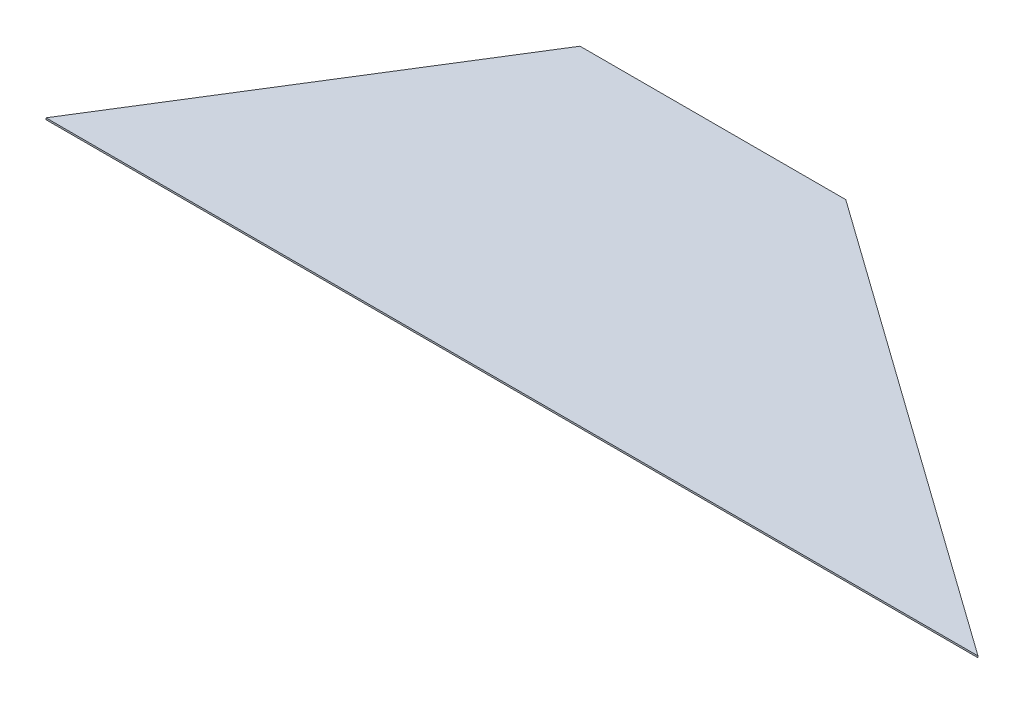
ISO-10303-21;
HEADER;
FILE_DESCRIPTION(('STEP AP214'),'2;1');
FILE_NAME('part.step','',(''),(''),'','','');
FILE_SCHEMA(('AUTOMOTIVE_DESIGN { 1 0 10303 214 1 1 1 1 }'));
ENDSEC;
DATA;
#1=APPLICATION_CONTEXT('core data for automotive mechanical design processes');
#2=APPLICATION_PROTOCOL_DEFINITION('international standard','automotive_design',2000,#1);
#3=PRODUCT_CONTEXT('',#1,'mechanical');
#4=PRODUCT('Part','Part','',(#3));
#5=PRODUCT_RELATED_PRODUCT_CATEGORY('part','',(#4));
#6=PRODUCT_DEFINITION_FORMATION('','',#4);
#7=PRODUCT_DEFINITION_CONTEXT('part definition',#1,'design');
#8=PRODUCT_DEFINITION('design','',#6,#7);
#9=PRODUCT_DEFINITION_SHAPE('','',#8);
#10=(LENGTH_UNIT() NAMED_UNIT(*) SI_UNIT(.MILLI.,.METRE.));
#11=(NAMED_UNIT(*) PLANE_ANGLE_UNIT() SI_UNIT($,.RADIAN.));
#12=(NAMED_UNIT(*) SI_UNIT($,.STERADIAN.) SOLID_ANGLE_UNIT());
#13=UNCERTAINTY_MEASURE_WITH_UNIT(LENGTH_MEASURE(1.E-05),#10,'distance_accuracy_value','');
#14=(GEOMETRIC_REPRESENTATION_CONTEXT(3) GLOBAL_UNCERTAINTY_ASSIGNED_CONTEXT((#13)) GLOBAL_UNIT_ASSIGNED_CONTEXT((#10,
#11,#12)) REPRESENTATION_CONTEXT('',''));
#15=CARTESIAN_POINT('',(0.,0.,0.));
#16=DIRECTION('',(0.,0.,1.));
#17=DIRECTION('',(1.,0.,0.));
#18=AXIS2_PLACEMENT_3D('',#15,#16,#17);
#19=CARTESIAN_POINT('',(52.381220258664,0.762,-98.6513718577558));
#20=DIRECTION('',(-0.580724681627554,0.,0.814100020973207));
#21=DIRECTION('',(0.814100020973207,0.,0.580724681627554));
#22=AXIS2_PLACEMENT_3D('',#19,#20,#21);
#23=PLANE('',#22);
#24=DIRECTION('',(-0.814100020973207,0.,-0.580724681627554));
#25=VECTOR('',#24,1.);
#26=CARTESIAN_POINT('',(52.381220258664,0.,-98.6513718577558));
#27=LINE('',#26,#25);
#28=CARTESIAN_POINT('',(263.177481940907,0.,51.7166281422441));
#29=VERTEX_POINT('',#28);
#30=CARTESIAN_POINT('',(52.381220258664,0.,-98.6513718577558));
#31=VERTEX_POINT('',#30);
#32=EDGE_CURVE('E98',#29,#31,#27,.T.);
#33=ORIENTED_EDGE('',*,*,#32,.T.);
#34=DIRECTION('',(0.,-1.,0.));
#35=VECTOR('',#34,1.);
#36=CARTESIAN_POINT('',(52.381220258664,0.762,-98.6513718577558));
#37=LINE('',#36,#35);
#38=CARTESIAN_POINT('',(52.381220258664,0.762,-98.6513718577558));
#39=VERTEX_POINT('',#38);
#40=EDGE_CURVE('E11',#39,#31,#37,.T.);
#41=ORIENTED_EDGE('',*,*,#40,.F.);
#42=DIRECTION('',(-0.814100020973207,0.,-0.580724681627554));
#43=VECTOR('',#42,1.);
#44=CARTESIAN_POINT('',(52.381220258664,0.762,-98.6513718577558));
#45=LINE('',#44,#43);
#46=CARTESIAN_POINT('',(263.177481940907,0.762,51.7166281422441));
#47=VERTEX_POINT('',#46);
#48=EDGE_CURVE('E86',#47,#39,#45,.T.);
#49=ORIENTED_EDGE('',*,*,#48,.F.);
#50=DIRECTION('',(0.,-1.,0.));
#51=VECTOR('',#50,1.);
#52=CARTESIAN_POINT('',(263.177481940907,0.762,51.7166281422441));
#53=LINE('',#52,#51);
#54=EDGE_CURVE('E94',#47,#29,#53,.T.);
#55=ORIENTED_EDGE('',*,*,#54,.T.);
#56=EDGE_LOOP('',(#33,#41,#49,#55));
#57=FACE_BOUND('',#56,.T.);
#58=ADVANCED_FACE('F35',(#57),#23,.F.);
#59=CARTESIAN_POINT('',(-69.0607444777623,0.762,-98.6513718577558));
#60=DIRECTION('',(0.,0.,1.));
#61=DIRECTION('',(1.,0.,0.));
#62=AXIS2_PLACEMENT_3D('',#59,#60,#61);
#63=PLANE('',#62);
#64=DIRECTION('',(-1.,0.,0.));
#65=VECTOR('',#64,1.);
#66=CARTESIAN_POINT('',(-69.0607444777623,0.,-98.6513718577558));
#67=LINE('',#66,#65);
#68=CARTESIAN_POINT('',(-69.0607444777623,0.,-98.6513718577558));
#69=VERTEX_POINT('',#68);
#70=EDGE_CURVE('E90',#31,#69,#67,.T.);
#71=ORIENTED_EDGE('',*,*,#70,.T.);
#72=DIRECTION('',(0.,-1.,0.));
#73=VECTOR('',#72,1.);
#74=CARTESIAN_POINT('',(-69.0607444777623,0.762,-98.6513718577558));
#75=LINE('',#74,#73);
#76=CARTESIAN_POINT('',(-69.0607444777623,0.762,-98.6513718577558));
#77=VERTEX_POINT('',#76);
#78=EDGE_CURVE('E43',#77,#69,#75,.T.);
#79=ORIENTED_EDGE('',*,*,#78,.F.);
#80=DIRECTION('',(-1.,0.,0.));
#81=VECTOR('',#80,1.);
#82=CARTESIAN_POINT('',(-69.0607444777623,0.762,-98.6513718577558));
#83=LINE('',#82,#81);
#84=EDGE_CURVE('E81',#39,#77,#83,.T.);
#85=ORIENTED_EDGE('',*,*,#84,.F.);
#86=ORIENTED_EDGE('',*,*,#40,.T.);
#87=EDGE_LOOP('',(#71,#79,#85,#86));
#88=FACE_BOUND('',#87,.T.);
#89=ADVANCED_FACE('F89',(#88),#63,.F.);
#90=CARTESIAN_POINT('',(-162.747971892092,0.762,51.7166281422441));
#91=DIRECTION('',(0.848740182159889,0.,0.52881008234261));
#92=DIRECTION('',(0.52881008234261,0.,-0.848740182159889));
#93=AXIS2_PLACEMENT_3D('',#90,#91,#92);
#94=PLANE('',#93);
#95=DIRECTION('',(-0.52881008234261,0.,0.848740182159889));
#96=VECTOR('',#95,1.);
#97=CARTESIAN_POINT('',(-162.747971892092,0.,51.7166281422441));
#98=LINE('',#97,#96);
#99=CARTESIAN_POINT('',(-162.747971892092,0.,51.7166281422441));
#100=VERTEX_POINT('',#99);
#101=EDGE_CURVE('E68',#69,#100,#98,.T.);
#102=ORIENTED_EDGE('',*,*,#101,.T.);
#103=DIRECTION('',(0.,-1.,0.));
#104=VECTOR('',#103,1.);
#105=CARTESIAN_POINT('',(-162.747971892092,0.762,51.7166281422441));
#106=LINE('',#105,#104);
#107=CARTESIAN_POINT('',(-162.747971892092,0.762,51.7166281422441));
#108=VERTEX_POINT('',#107);
#109=EDGE_CURVE('E91',#108,#100,#106,.T.);
#110=ORIENTED_EDGE('',*,*,#109,.F.);
#111=DIRECTION('',(-0.52881008234261,0.,0.848740182159889));
#112=VECTOR('',#111,1.);
#113=CARTESIAN_POINT('',(-162.747971892092,0.762,51.7166281422441));
#114=LINE('',#113,#112);
#115=EDGE_CURVE('E84',#77,#108,#114,.T.);
#116=ORIENTED_EDGE('',*,*,#115,.F.);
#117=ORIENTED_EDGE('',*,*,#78,.T.);
#118=EDGE_LOOP('',(#102,#110,#116,#117));
#119=FACE_BOUND('',#118,.T.);
#120=ADVANCED_FACE('F92',(#119),#94,.F.);
#121=CARTESIAN_POINT('',(263.177481940907,0.762,51.7166281422441));
#122=DIRECTION('',(0.,0.,-1.));
#123=DIRECTION('',(-1.,0.,0.));
#124=AXIS2_PLACEMENT_3D('',#121,#122,#123);
#125=PLANE('',#124);
#126=DIRECTION('',(1.,0.,0.));
#127=VECTOR('',#126,1.);
#128=CARTESIAN_POINT('',(263.177481940907,0.,51.7166281422441));
#129=LINE('',#128,#127);
#130=EDGE_CURVE('E74',#100,#29,#129,.T.);
#131=ORIENTED_EDGE('',*,*,#130,.T.);
#132=ORIENTED_EDGE('',*,*,#54,.F.);
#133=DIRECTION('',(1.,0.,0.));
#134=VECTOR('',#133,1.);
#135=CARTESIAN_POINT('',(263.177481940907,0.762,51.7166281422441));
#136=LINE('',#135,#134);
#137=EDGE_CURVE('E51',#108,#47,#136,.T.);
#138=ORIENTED_EDGE('',*,*,#137,.F.);
#139=ORIENTED_EDGE('',*,*,#109,.T.);
#140=EDGE_LOOP('',(#131,#132,#138,#139));
#141=FACE_BOUND('',#140,.T.);
#142=ADVANCED_FACE('F105',(#141),#125,.F.);
#143=CARTESIAN_POINT('',(0.,0.762,0.));
#144=DIRECTION('',(0.,1.,0.));
#145=DIRECTION('',(0.,0.,1.));
#146=AXIS2_PLACEMENT_3D('',#143,#144,#145);
#147=PLANE('',#146);
#148=ORIENTED_EDGE('',*,*,#48,.T.);
#149=ORIENTED_EDGE('',*,*,#84,.T.);
#150=ORIENTED_EDGE('',*,*,#115,.T.);
#151=ORIENTED_EDGE('',*,*,#137,.T.);
#152=EDGE_LOOP('',(#148,#149,#150,#151));
#153=FACE_BOUND('',#152,.T.);
#154=ADVANCED_FACE('F82',(#153),#147,.T.);
#155=CARTESIAN_POINT('',(0.,0.,0.));
#156=DIRECTION('',(0.,1.,0.));
#157=DIRECTION('',(0.,0.,1.));
#158=AXIS2_PLACEMENT_3D('',#155,#156,#157);
#159=PLANE('',#158);
#160=ORIENTED_EDGE('',*,*,#32,.F.);
#161=ORIENTED_EDGE('',*,*,#130,.F.);
#162=ORIENTED_EDGE('',*,*,#101,.F.);
#163=ORIENTED_EDGE('',*,*,#70,.F.);
#164=EDGE_LOOP('',(#160,#161,#162,#163));
#165=FACE_BOUND('',#164,.T.);
#166=ADVANCED_FACE('F108',(#165),#159,.F.);
#167=CLOSED_SHELL('',(#58,#89,#120,#142,#154,#166));
#168=MANIFOLD_SOLID_BREP('B2',#167);
#169=ADVANCED_BREP_SHAPE_REPRESENTATION('',(#18,#168),#14);
#170=SHAPE_DEFINITION_REPRESENTATION(#9,#169);
ENDSEC;
END-ISO-10303-21;
